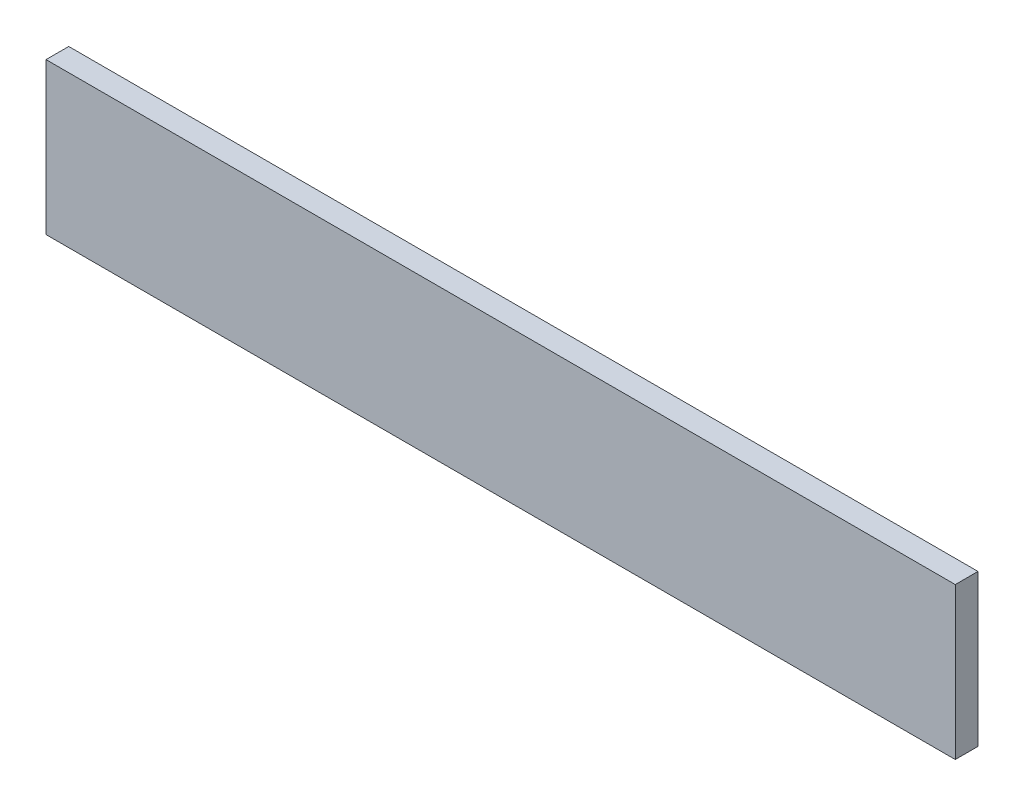
ISO-10303-21;
HEADER;
FILE_DESCRIPTION(('STEP AP214'),'2;1');
FILE_NAME('part.step','',(''),(''),'','','');
FILE_SCHEMA(('AUTOMOTIVE_DESIGN { 1 0 10303 214 1 1 1 1 }'));
ENDSEC;
DATA;
#1=APPLICATION_CONTEXT('core data for automotive mechanical design processes');
#2=APPLICATION_PROTOCOL_DEFINITION('international standard','automotive_design',2000,#1);
#3=PRODUCT_CONTEXT('',#1,'mechanical');
#4=PRODUCT('Part','Part','',(#3));
#5=PRODUCT_RELATED_PRODUCT_CATEGORY('part','',(#4));
#6=PRODUCT_DEFINITION_FORMATION('','',#4);
#7=PRODUCT_DEFINITION_CONTEXT('part definition',#1,'design');
#8=PRODUCT_DEFINITION('design','',#6,#7);
#9=PRODUCT_DEFINITION_SHAPE('','',#8);
#10=(LENGTH_UNIT() NAMED_UNIT(*) SI_UNIT(.MILLI.,.METRE.));
#11=(NAMED_UNIT(*) PLANE_ANGLE_UNIT() SI_UNIT($,.RADIAN.));
#12=(NAMED_UNIT(*) SI_UNIT($,.STERADIAN.) SOLID_ANGLE_UNIT());
#13=UNCERTAINTY_MEASURE_WITH_UNIT(LENGTH_MEASURE(1.E-05),#10,'distance_accuracy_value','');
#14=(GEOMETRIC_REPRESENTATION_CONTEXT(3) GLOBAL_UNCERTAINTY_ASSIGNED_CONTEXT((#13)) GLOBAL_UNIT_ASSIGNED_CONTEXT((#10,
#11,#12)) REPRESENTATION_CONTEXT('',''));
#15=CARTESIAN_POINT('',(0.,0.,0.));
#16=DIRECTION('',(0.,0.,1.));
#17=DIRECTION('',(1.,0.,0.));
#18=AXIS2_PLACEMENT_3D('',#15,#16,#17);
#19=CARTESIAN_POINT('',(-60.,-10.,3.));
#20=DIRECTION('',(1.,0.,0.));
#21=DIRECTION('',(0.,0.,-1.));
#22=AXIS2_PLACEMENT_3D('',#19,#20,#21);
#23=PLANE('',#22);
#24=DIRECTION('',(0.,-1.,0.));
#25=VECTOR('',#24,1.);
#26=CARTESIAN_POINT('',(-60.,-10.,0.));
#27=LINE('',#26,#25);
#28=CARTESIAN_POINT('',(-60.,9.99999999999999,0.));
#29=VERTEX_POINT('',#28);
#30=CARTESIAN_POINT('',(-60.,-10.,0.));
#31=VERTEX_POINT('',#30);
#32=EDGE_CURVE('E113',#29,#31,#27,.T.);
#33=ORIENTED_EDGE('',*,*,#32,.T.);
#34=DIRECTION('',(0.,0.,-1.));
#35=VECTOR('',#34,1.);
#36=CARTESIAN_POINT('',(-60.,-10.,3.));
#37=LINE('',#36,#35);
#38=CARTESIAN_POINT('',(-60.,-10.,3.));
#39=VERTEX_POINT('',#38);
#40=EDGE_CURVE('E11',#39,#31,#37,.T.);
#41=ORIENTED_EDGE('',*,*,#40,.F.);
#42=DIRECTION('',(0.,-1.,0.));
#43=VECTOR('',#42,1.);
#44=CARTESIAN_POINT('',(-60.,-10.,3.));
#45=LINE('',#44,#43);
#46=CARTESIAN_POINT('',(-60.,9.99999999999999,3.));
#47=VERTEX_POINT('',#46);
#48=EDGE_CURVE('E97',#47,#39,#45,.T.);
#49=ORIENTED_EDGE('',*,*,#48,.F.);
#50=DIRECTION('',(0.,0.,-1.));
#51=VECTOR('',#50,1.);
#52=CARTESIAN_POINT('',(-60.,9.99999999999999,3.));
#53=LINE('',#52,#51);
#54=EDGE_CURVE('E109',#47,#29,#53,.T.);
#55=ORIENTED_EDGE('',*,*,#54,.T.);
#56=EDGE_LOOP('',(#33,#41,#49,#55));
#57=FACE_BOUND('',#56,.T.);
#58=ADVANCED_FACE('F45',(#57),#23,.F.);
#59=CARTESIAN_POINT('',(60.,-9.99999999999999,3.));
#60=DIRECTION('',(0.,1.,0.));
#61=DIRECTION('',(-1.,0.,0.));
#62=AXIS2_PLACEMENT_3D('',#59,#60,#61);
#63=PLANE('',#62);
#64=DIRECTION('',(1.,0.,0.));
#65=VECTOR('',#64,1.);
#66=CARTESIAN_POINT('',(60.,-9.99999999999999,0.));
#67=LINE('',#66,#65);
#68=CARTESIAN_POINT('',(60.,-9.99999999999999,0.));
#69=VERTEX_POINT('',#68);
#70=EDGE_CURVE('E102',#31,#69,#67,.T.);
#71=ORIENTED_EDGE('',*,*,#70,.T.);
#72=DIRECTION('',(0.,0.,-1.));
#73=VECTOR('',#72,1.);
#74=CARTESIAN_POINT('',(60.,-9.99999999999999,3.));
#75=LINE('',#74,#73);
#76=CARTESIAN_POINT('',(60.,-9.99999999999999,3.));
#77=VERTEX_POINT('',#76);
#78=EDGE_CURVE('E54',#77,#69,#75,.T.);
#79=ORIENTED_EDGE('',*,*,#78,.F.);
#80=DIRECTION('',(1.,0.,0.));
#81=VECTOR('',#80,1.);
#82=CARTESIAN_POINT('',(60.,-9.99999999999999,3.));
#83=LINE('',#82,#81);
#84=EDGE_CURVE('E92',#39,#77,#83,.T.);
#85=ORIENTED_EDGE('',*,*,#84,.F.);
#86=ORIENTED_EDGE('',*,*,#40,.T.);
#87=EDGE_LOOP('',(#71,#79,#85,#86));
#88=FACE_BOUND('',#87,.T.);
#89=ADVANCED_FACE('F101',(#88),#63,.F.);
#90=CARTESIAN_POINT('',(60.,-9.99999999999999,3.));
#91=DIRECTION('',(-1.,0.,0.));
#92=DIRECTION('',(0.,0.,1.));
#93=AXIS2_PLACEMENT_3D('',#90,#91,#92);
#94=PLANE('',#93);
#95=DIRECTION('',(0.,1.,0.));
#96=VECTOR('',#95,1.);
#97=CARTESIAN_POINT('',(60.,-9.99999999999999,0.));
#98=LINE('',#97,#96);
#99=CARTESIAN_POINT('',(60.,10.,0.));
#100=VERTEX_POINT('',#99);
#101=EDGE_CURVE('E79',#69,#100,#98,.T.);
#102=ORIENTED_EDGE('',*,*,#101,.T.);
#103=DIRECTION('',(0.,0.,-1.));
#104=VECTOR('',#103,1.);
#105=CARTESIAN_POINT('',(60.,10.,3.));
#106=LINE('',#105,#104);
#107=CARTESIAN_POINT('',(60.,10.,3.));
#108=VERTEX_POINT('',#107);
#109=EDGE_CURVE('E104',#108,#100,#106,.T.);
#110=ORIENTED_EDGE('',*,*,#109,.F.);
#111=DIRECTION('',(0.,1.,0.));
#112=VECTOR('',#111,1.);
#113=CARTESIAN_POINT('',(60.,-9.99999999999999,3.));
#114=LINE('',#113,#112);
#115=EDGE_CURVE('E95',#77,#108,#114,.T.);
#116=ORIENTED_EDGE('',*,*,#115,.F.);
#117=ORIENTED_EDGE('',*,*,#78,.T.);
#118=EDGE_LOOP('',(#102,#110,#116,#117));
#119=FACE_BOUND('',#118,.T.);
#120=ADVANCED_FACE('F105',(#119),#94,.F.);
#121=CARTESIAN_POINT('',(60.,10.,3.));
#122=DIRECTION('',(0.,-1.,0.));
#123=DIRECTION('',(1.,0.,0.));
#124=AXIS2_PLACEMENT_3D('',#121,#122,#123);
#125=PLANE('',#124);
#126=DIRECTION('',(-1.,0.,0.));
#127=VECTOR('',#126,1.);
#128=CARTESIAN_POINT('',(60.,10.,0.));
#129=LINE('',#128,#127);
#130=EDGE_CURVE('E85',#100,#29,#129,.T.);
#131=ORIENTED_EDGE('',*,*,#130,.T.);
#132=ORIENTED_EDGE('',*,*,#54,.F.);
#133=DIRECTION('',(-1.,0.,0.));
#134=VECTOR('',#133,1.);
#135=CARTESIAN_POINT('',(60.,10.,3.));
#136=LINE('',#135,#134);
#137=EDGE_CURVE('E62',#108,#47,#136,.T.);
#138=ORIENTED_EDGE('',*,*,#137,.F.);
#139=ORIENTED_EDGE('',*,*,#109,.T.);
#140=EDGE_LOOP('',(#131,#132,#138,#139));
#141=FACE_BOUND('',#140,.T.);
#142=ADVANCED_FACE('F126',(#141),#125,.F.);
#143=CARTESIAN_POINT('',(0.,0.,3.));
#144=DIRECTION('',(0.,0.,1.));
#145=DIRECTION('',(1.,0.,0.));
#146=AXIS2_PLACEMENT_3D('',#143,#144,#145);
#147=PLANE('',#146);
#148=ORIENTED_EDGE('',*,*,#48,.T.);
#149=ORIENTED_EDGE('',*,*,#84,.T.);
#150=ORIENTED_EDGE('',*,*,#115,.T.);
#151=ORIENTED_EDGE('',*,*,#137,.T.);
#152=EDGE_LOOP('',(#148,#149,#150,#151));
#153=FACE_BOUND('',#152,.T.);
#154=ADVANCED_FACE('F93',(#153),#147,.T.);
#155=CARTESIAN_POINT('',(0.,0.,0.));
#156=DIRECTION('',(0.,0.,1.));
#157=DIRECTION('',(1.,0.,0.));
#158=AXIS2_PLACEMENT_3D('',#155,#156,#157);
#159=PLANE('',#158);
#160=ORIENTED_EDGE('',*,*,#32,.F.);
#161=ORIENTED_EDGE('',*,*,#130,.F.);
#162=ORIENTED_EDGE('',*,*,#101,.F.);
#163=ORIENTED_EDGE('',*,*,#70,.F.);
#164=EDGE_LOOP('',(#160,#161,#162,#163));
#165=FACE_BOUND('',#164,.T.);
#166=ADVANCED_FACE('F129',(#165),#159,.F.);
#167=CLOSED_SHELL('',(#58,#89,#120,#142,#154,#166));
#168=MANIFOLD_SOLID_BREP('B2',#167);
#169=ADVANCED_BREP_SHAPE_REPRESENTATION('',(#18,#168),#14);
#170=SHAPE_DEFINITION_REPRESENTATION(#9,#169);
ENDSEC;
END-ISO-10303-21;
